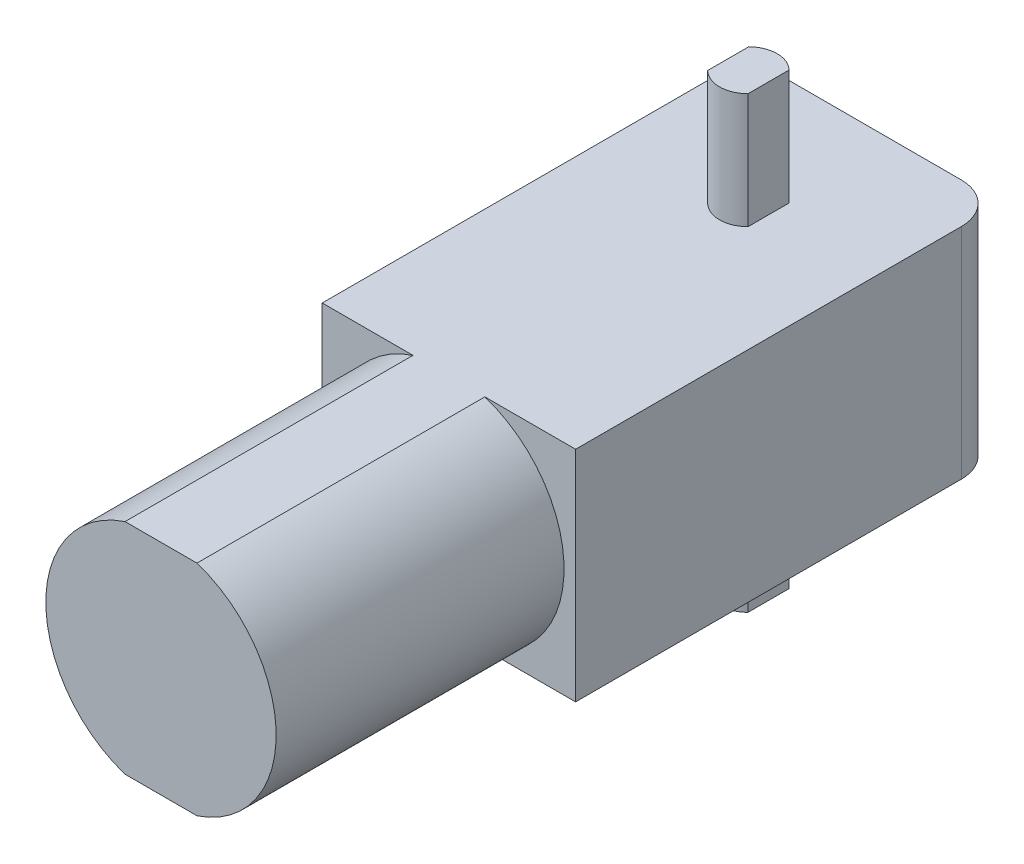
ISO-10303-21;
HEADER;
FILE_DESCRIPTION(('STEP AP214'),'2;1');
FILE_NAME('part.step','',(''),(''),'','','');
FILE_SCHEMA(('AUTOMOTIVE_DESIGN { 1 0 10303 214 1 1 1 1 }'));
ENDSEC;
DATA;
#1=APPLICATION_CONTEXT('core data for automotive mechanical design processes');
#2=APPLICATION_PROTOCOL_DEFINITION('international standard','automotive_design',2000,#1);
#3=PRODUCT_CONTEXT('',#1,'mechanical');
#4=PRODUCT('Part','Part','',(#3));
#5=PRODUCT_RELATED_PRODUCT_CATEGORY('part','',(#4));
#6=PRODUCT_DEFINITION_FORMATION('','',#4);
#7=PRODUCT_DEFINITION_CONTEXT('part definition',#1,'design');
#8=PRODUCT_DEFINITION('design','',#6,#7);
#9=PRODUCT_DEFINITION_SHAPE('','',#8);
#10=(LENGTH_UNIT() NAMED_UNIT(*) SI_UNIT(.MILLI.,.METRE.));
#11=(NAMED_UNIT(*) PLANE_ANGLE_UNIT() SI_UNIT($,.RADIAN.));
#12=(NAMED_UNIT(*) SI_UNIT($,.STERADIAN.) SOLID_ANGLE_UNIT());
#13=UNCERTAINTY_MEASURE_WITH_UNIT(LENGTH_MEASURE(1.E-05),#10,'distance_accuracy_value','');
#14=(GEOMETRIC_REPRESENTATION_CONTEXT(3) GLOBAL_UNCERTAINTY_ASSIGNED_CONTEXT((#13)) GLOBAL_UNIT_ASSIGNED_CONTEXT((#10,
#11,#12)) REPRESENTATION_CONTEXT('',''));
#15=CARTESIAN_POINT('',(0.,0.,0.));
#16=DIRECTION('',(0.,0.,1.));
#17=DIRECTION('',(1.,0.,0.));
#18=AXIS2_PLACEMENT_3D('',#15,#16,#17);
#19=CARTESIAN_POINT('',(0.,0.,37.));
#20=DIRECTION('',(0.,0.,-1.));
#21=DIRECTION('',(-1.,0.,0.));
#22=AXIS2_PLACEMENT_3D('',#19,#20,#21);
#23=PLANE('',#22);
#24=CARTESIAN_POINT('',(-11.,9.5,37.));
#25=DIRECTION('',(0.,0.,1.));
#26=DIRECTION('',(1.,0.,0.));
#27=AXIS2_PLACEMENT_3D('',#24,#25,#26);
#28=CIRCLE('',#27,10.);
#29=CARTESIAN_POINT('',(-7.8775010008008,0.,37.));
#30=VERTEX_POINT('',#29);
#31=CARTESIAN_POINT('',(-7.8775010008008,19.,37.));
#32=VERTEX_POINT('',#31);
#33=EDGE_CURVE('E185',#30,#32,#28,.T.);
#34=ORIENTED_EDGE('',*,*,#33,.F.);
#35=DIRECTION('',(1.,0.,0.));
#36=VECTOR('',#35,1.);
#37=CARTESIAN_POINT('',(0.,0.,37.));
#38=LINE('',#37,#36);
#39=CARTESIAN_POINT('',(0.,0.,37.));
#40=VERTEX_POINT('',#39);
#41=EDGE_CURVE('E246',#30,#40,#38,.T.);
#42=ORIENTED_EDGE('',*,*,#41,.T.);
#43=DIRECTION('',(0.,1.,0.));
#44=VECTOR('',#43,1.);
#45=CARTESIAN_POINT('',(0.,0.,37.));
#46=LINE('',#45,#44);
#47=CARTESIAN_POINT('',(0.,19.,37.));
#48=VERTEX_POINT('',#47);
#49=EDGE_CURVE('E245',#40,#48,#46,.T.);
#50=ORIENTED_EDGE('',*,*,#49,.T.);
#51=DIRECTION('',(-1.,0.,0.));
#52=VECTOR('',#51,1.);
#53=CARTESIAN_POINT('',(0.,19.,37.));
#54=LINE('',#53,#52);
#55=EDGE_CURVE('E64',#48,#32,#54,.T.);
#56=ORIENTED_EDGE('',*,*,#55,.T.);
#57=EDGE_LOOP('',(#34,#42,#50,#56));
#58=FACE_BOUND('',#57,.T.);
#59=ADVANCED_FACE('F41',(#58),#23,.F.);
#60=CARTESIAN_POINT('',(0.,0.,37.));
#61=DIRECTION('',(0.,1.,0.));
#62=DIRECTION('',(0.,0.,1.));
#63=AXIS2_PLACEMENT_3D('',#60,#61,#62);
#64=PLANE('',#63);
#65=DIRECTION('',(0.,0.,1.));
#66=VECTOR('',#65,1.);
#67=CARTESIAN_POINT('',(-9.24999999999997,0.,37.));
#68=LINE('',#67,#66);
#69=CARTESIAN_POINT('',(-9.25,0.,9.21464289286429));
#70=VERTEX_POINT('',#69);
#71=CARTESIAN_POINT('',(-9.24999999999999,0.,12.7853571071357));
#72=VERTEX_POINT('',#71);
#73=EDGE_CURVE('E239',#70,#72,#68,.T.);
#74=ORIENTED_EDGE('',*,*,#73,.F.);
#75=CARTESIAN_POINT('',(-11.,0.,11.));
#76=DIRECTION('',(0.,1.,0.));
#77=DIRECTION('',(0.,0.,1.));
#78=AXIS2_PLACEMENT_3D('',#75,#76,#77);
#79=CIRCLE('',#78,2.5);
#80=CARTESIAN_POINT('',(-12.75,0.,9.21464289286429));
#81=VERTEX_POINT('',#80);
#82=EDGE_CURVE('E236',#81,#70,#79,.F.);
#83=ORIENTED_EDGE('',*,*,#82,.F.);
#84=DIRECTION('',(0.,0.,1.));
#85=VECTOR('',#84,1.);
#86=CARTESIAN_POINT('',(-12.75,0.,37.));
#87=LINE('',#86,#85);
#88=CARTESIAN_POINT('',(-12.75,0.,12.7853571071357));
#89=VERTEX_POINT('',#88);
#90=EDGE_CURVE('E234',#81,#89,#87,.T.);
#91=ORIENTED_EDGE('',*,*,#90,.T.);
#92=CARTESIAN_POINT('',(-11.,0.,11.));
#93=DIRECTION('',(0.,1.,0.));
#94=DIRECTION('',(0.,0.,1.));
#95=AXIS2_PLACEMENT_3D('',#92,#93,#94);
#96=CIRCLE('',#95,2.5);
#97=EDGE_CURVE('E231',#72,#89,#96,.F.);
#98=ORIENTED_EDGE('',*,*,#97,.F.);
#99=EDGE_LOOP('',(#74,#83,#91,#98));
#100=FACE_BOUND('',#99,.T.);
#101=DIRECTION('',(0.,0.,-1.));
#102=VECTOR('',#101,1.);
#103=CARTESIAN_POINT('',(-22.,0.,37.));
#104=LINE('',#103,#102);
#105=CARTESIAN_POINT('',(-22.,0.,37.));
#106=VERTEX_POINT('',#105);
#107=CARTESIAN_POINT('',(-22.,0.,3.5));
#108=VERTEX_POINT('',#107);
#109=EDGE_CURVE('E251',#106,#108,#104,.T.);
#110=ORIENTED_EDGE('',*,*,#109,.T.);
#111=CARTESIAN_POINT('',(-18.5,0.,3.5));
#112=DIRECTION('',(0.,1.,0.));
#113=DIRECTION('',(0.,0.,1.));
#114=AXIS2_PLACEMENT_3D('',#111,#112,#113);
#115=CIRCLE('',#114,3.5);
#116=CARTESIAN_POINT('',(-18.5,0.,0.));
#117=VERTEX_POINT('',#116);
#118=EDGE_CURVE('E272',#108,#117,#115,.F.);
#119=ORIENTED_EDGE('',*,*,#118,.T.);
#120=DIRECTION('',(1.,0.,0.));
#121=VECTOR('',#120,1.);
#122=CARTESIAN_POINT('',(0.,0.,0.));
#123=LINE('',#122,#121);
#124=CARTESIAN_POINT('',(-3.5,0.,0.));
#125=VERTEX_POINT('',#124);
#126=EDGE_CURVE('E242',#117,#125,#123,.T.);
#127=ORIENTED_EDGE('',*,*,#126,.T.);
#128=CARTESIAN_POINT('',(-3.5,0.,3.5));
#129=DIRECTION('',(0.,1.,0.));
#130=DIRECTION('',(0.,0.,1.));
#131=AXIS2_PLACEMENT_3D('',#128,#129,#130);
#132=CIRCLE('',#131,3.5);
#133=CARTESIAN_POINT('',(0.,0.,3.5));
#134=VERTEX_POINT('',#133);
#135=EDGE_CURVE('E270',#125,#134,#132,.F.);
#136=ORIENTED_EDGE('',*,*,#135,.T.);
#137=DIRECTION('',(0.,0.,-1.));
#138=VECTOR('',#137,1.);
#139=CARTESIAN_POINT('',(0.,0.,37.));
#140=LINE('',#139,#138);
#141=EDGE_CURVE('E264',#40,#134,#140,.T.);
#142=ORIENTED_EDGE('',*,*,#141,.F.);
#143=ORIENTED_EDGE('',*,*,#41,.F.);
#144=DIRECTION('',(0.,0.,-1.));
#145=VECTOR('',#144,1.);
#146=CARTESIAN_POINT('',(-7.8775010008008,0.,62.));
#147=LINE('',#146,#145);
#148=CARTESIAN_POINT('',(-7.8775010008008,0.,62.));
#149=VERTEX_POINT('',#148);
#150=EDGE_CURVE('E196',#149,#30,#147,.T.);
#151=ORIENTED_EDGE('',*,*,#150,.F.);
#152=DIRECTION('',(1.,0.,0.));
#153=VECTOR('',#152,1.);
#154=CARTESIAN_POINT('',(0.,0.,62.));
#155=LINE('',#154,#153);
#156=CARTESIAN_POINT('',(-14.1224989991992,0.,62.));
#157=VERTEX_POINT('',#156);
#158=EDGE_CURVE('E175',#157,#149,#155,.T.);
#159=ORIENTED_EDGE('',*,*,#158,.F.);
#160=DIRECTION('',(0.,0.,-1.));
#161=VECTOR('',#160,1.);
#162=CARTESIAN_POINT('',(-14.1224989991992,0.,62.));
#163=LINE('',#162,#161);
#164=CARTESIAN_POINT('',(-14.1224989991992,0.,37.));
#165=VERTEX_POINT('',#164);
#166=EDGE_CURVE('E172',#157,#165,#163,.T.);
#167=ORIENTED_EDGE('',*,*,#166,.T.);
#168=EDGE_CURVE('E243',#106,#165,#38,.T.);
#169=ORIENTED_EDGE('',*,*,#168,.F.);
#170=EDGE_LOOP('',(#110,#119,#127,#136,#142,#143,#151,#159,#167,#169));
#171=FACE_BOUND('',#170,.T.);
#172=ADVANCED_FACE('F327',(#100,#171),#64,.F.);
#173=CARTESIAN_POINT('',(0.,0.,37.));
#174=DIRECTION('',(-1.,0.,0.));
#175=DIRECTION('',(0.,0.,1.));
#176=AXIS2_PLACEMENT_3D('',#173,#174,#175);
#177=PLANE('',#176);
#178=ORIENTED_EDGE('',*,*,#141,.T.);
#179=DIRECTION('',(0.,1.,0.));
#180=VECTOR('',#179,1.);
#181=CARTESIAN_POINT('',(0.,19.,3.5));
#182=LINE('',#181,#180);
#183=CARTESIAN_POINT('',(0.,19.,3.5));
#184=VERTEX_POINT('',#183);
#185=EDGE_CURVE('E282',#134,#184,#182,.T.);
#186=ORIENTED_EDGE('',*,*,#185,.T.);
#187=DIRECTION('',(0.,0.,-1.));
#188=VECTOR('',#187,1.);
#189=CARTESIAN_POINT('',(0.,19.,37.));
#190=LINE('',#189,#188);
#191=EDGE_CURVE('E261',#48,#184,#190,.T.);
#192=ORIENTED_EDGE('',*,*,#191,.F.);
#193=ORIENTED_EDGE('',*,*,#49,.F.);
#194=EDGE_LOOP('',(#178,#186,#192,#193));
#195=FACE_BOUND('',#194,.T.);
#196=ADVANCED_FACE('F347',(#195),#177,.F.);
#197=CARTESIAN_POINT('',(0.,19.,37.));
#198=DIRECTION('',(0.,-1.,0.));
#199=DIRECTION('',(0.,0.,-1.));
#200=AXIS2_PLACEMENT_3D('',#197,#198,#199);
#201=PLANE('',#200);
#202=DIRECTION('',(0.,0.,-1.));
#203=VECTOR('',#202,1.);
#204=CARTESIAN_POINT('',(-9.24999999999997,19.,37.));
#205=LINE('',#204,#203);
#206=CARTESIAN_POINT('',(-9.24999999999999,19.,12.7853571071357));
#207=VERTEX_POINT('',#206);
#208=CARTESIAN_POINT('',(-9.25,19.,9.21464289286429));
#209=VERTEX_POINT('',#208);
#210=EDGE_CURVE('E11',#207,#209,#205,.T.);
#211=ORIENTED_EDGE('',*,*,#210,.F.);
#212=CARTESIAN_POINT('',(-11.,19.,11.));
#213=DIRECTION('',(0.,-1.,0.));
#214=DIRECTION('',(0.,0.,-1.));
#215=AXIS2_PLACEMENT_3D('',#212,#213,#214);
#216=CIRCLE('',#215,2.5);
#217=CARTESIAN_POINT('',(-12.75,19.,12.7853571071357));
#218=VERTEX_POINT('',#217);
#219=EDGE_CURVE('E285',#218,#207,#216,.F.);
#220=ORIENTED_EDGE('',*,*,#219,.F.);
#221=DIRECTION('',(0.,0.,-1.));
#222=VECTOR('',#221,1.);
#223=CARTESIAN_POINT('',(-12.75,19.,37.));
#224=LINE('',#223,#222);
#225=CARTESIAN_POINT('',(-12.75,19.,9.21464289286429));
#226=VERTEX_POINT('',#225);
#227=EDGE_CURVE('E288',#218,#226,#224,.T.);
#228=ORIENTED_EDGE('',*,*,#227,.T.);
#229=CARTESIAN_POINT('',(-11.,19.,11.));
#230=DIRECTION('',(0.,-1.,0.));
#231=DIRECTION('',(0.,0.,-1.));
#232=AXIS2_PLACEMENT_3D('',#229,#230,#231);
#233=CIRCLE('',#232,2.5);
#234=EDGE_CURVE('E49',#209,#226,#233,.F.);
#235=ORIENTED_EDGE('',*,*,#234,.F.);
#236=EDGE_LOOP('',(#211,#220,#228,#235));
#237=FACE_BOUND('',#236,.T.);
#238=DIRECTION('',(-1.,0.,0.));
#239=VECTOR('',#238,1.);
#240=CARTESIAN_POINT('',(0.,19.,0.));
#241=LINE('',#240,#239);
#242=CARTESIAN_POINT('',(-3.5,19.,0.));
#243=VERTEX_POINT('',#242);
#244=CARTESIAN_POINT('',(-18.5,19.,0.));
#245=VERTEX_POINT('',#244);
#246=EDGE_CURVE('E254',#243,#245,#241,.T.);
#247=ORIENTED_EDGE('',*,*,#246,.T.);
#248=CARTESIAN_POINT('',(-18.5,19.,3.5));
#249=DIRECTION('',(0.,-1.,0.));
#250=DIRECTION('',(0.,0.,-1.));
#251=AXIS2_PLACEMENT_3D('',#248,#249,#250);
#252=CIRCLE('',#251,3.5);
#253=CARTESIAN_POINT('',(-22.,19.,3.5));
#254=VERTEX_POINT('',#253);
#255=EDGE_CURVE('E280',#245,#254,#252,.F.);
#256=ORIENTED_EDGE('',*,*,#255,.T.);
#257=DIRECTION('',(0.,0.,-1.));
#258=VECTOR('',#257,1.);
#259=CARTESIAN_POINT('',(-22.,19.,37.));
#260=LINE('',#259,#258);
#261=CARTESIAN_POINT('',(-22.,19.,37.));
#262=VERTEX_POINT('',#261);
#263=EDGE_CURVE('E258',#262,#254,#260,.T.);
#264=ORIENTED_EDGE('',*,*,#263,.F.);
#265=CARTESIAN_POINT('',(-14.1224989991992,19.,37.));
#266=VERTEX_POINT('',#265);
#267=EDGE_CURVE('E190',#266,#262,#54,.T.);
#268=ORIENTED_EDGE('',*,*,#267,.F.);
#269=DIRECTION('',(0.,0.,-1.));
#270=VECTOR('',#269,1.);
#271=CARTESIAN_POINT('',(-14.1224989991992,19.,62.));
#272=LINE('',#271,#270);
#273=CARTESIAN_POINT('',(-14.1224989991992,19.,62.));
#274=VERTEX_POINT('',#273);
#275=EDGE_CURVE('E170',#274,#266,#272,.T.);
#276=ORIENTED_EDGE('',*,*,#275,.F.);
#277=DIRECTION('',(-1.,0.,0.));
#278=VECTOR('',#277,1.);
#279=CARTESIAN_POINT('',(0.,19.,62.));
#280=LINE('',#279,#278);
#281=CARTESIAN_POINT('',(-7.8775010008008,19.,62.));
#282=VERTEX_POINT('',#281);
#283=EDGE_CURVE('E176',#282,#274,#280,.T.);
#284=ORIENTED_EDGE('',*,*,#283,.F.);
#285=DIRECTION('',(0.,0.,-1.));
#286=VECTOR('',#285,1.);
#287=CARTESIAN_POINT('',(-7.8775010008008,19.,62.));
#288=LINE('',#287,#286);
#289=EDGE_CURVE('E387',#282,#32,#288,.T.);
#290=ORIENTED_EDGE('',*,*,#289,.T.);
#291=ORIENTED_EDGE('',*,*,#55,.F.);
#292=ORIENTED_EDGE('',*,*,#191,.T.);
#293=CARTESIAN_POINT('',(-3.5,19.,3.5));
#294=DIRECTION('',(0.,-1.,0.));
#295=DIRECTION('',(0.,0.,-1.));
#296=AXIS2_PLACEMENT_3D('',#293,#294,#295);
#297=CIRCLE('',#296,3.5);
#298=EDGE_CURVE('E278',#184,#243,#297,.F.);
#299=ORIENTED_EDGE('',*,*,#298,.T.);
#300=EDGE_LOOP('',(#247,#256,#264,#268,#276,#284,#290,#291,#292,#299));
#301=FACE_BOUND('',#300,.T.);
#302=ADVANCED_FACE('F188',(#237,#301),#201,.F.);
#303=CARTESIAN_POINT('',(-22.,0.,37.));
#304=DIRECTION('',(1.,0.,0.));
#305=DIRECTION('',(0.,0.,-1.));
#306=AXIS2_PLACEMENT_3D('',#303,#304,#305);
#307=PLANE('',#306);
#308=ORIENTED_EDGE('',*,*,#263,.T.);
#309=DIRECTION('',(0.,-1.,0.));
#310=VECTOR('',#309,1.);
#311=CARTESIAN_POINT('',(-22.,0.,3.5));
#312=LINE('',#311,#310);
#313=EDGE_CURVE('E267',#254,#108,#312,.T.);
#314=ORIENTED_EDGE('',*,*,#313,.T.);
#315=ORIENTED_EDGE('',*,*,#109,.F.);
#316=DIRECTION('',(0.,-1.,0.));
#317=VECTOR('',#316,1.);
#318=CARTESIAN_POINT('',(-22.,0.,37.));
#319=LINE('',#318,#317);
#320=EDGE_CURVE('E249',#262,#106,#319,.T.);
#321=ORIENTED_EDGE('',*,*,#320,.F.);
#322=EDGE_LOOP('',(#308,#314,#315,#321));
#323=FACE_BOUND('',#322,.T.);
#324=ADVANCED_FACE('F352',(#323),#307,.F.);
#325=CARTESIAN_POINT('',(-11.,9.5,37.));
#326=DIRECTION('',(0.,0.,1.));
#327=DIRECTION('',(1.,0.,0.));
#328=AXIS2_PLACEMENT_3D('',#325,#326,#327);
#329=CIRCLE('',#328,10.);
#330=EDGE_CURVE('E56',#266,#165,#329,.T.);
#331=ORIENTED_EDGE('',*,*,#330,.F.);
#332=ORIENTED_EDGE('',*,*,#267,.T.);
#333=ORIENTED_EDGE('',*,*,#320,.T.);
#334=ORIENTED_EDGE('',*,*,#168,.T.);
#335=EDGE_LOOP('',(#331,#332,#333,#334));
#336=FACE_BOUND('',#335,.T.);
#337=ADVANCED_FACE('F342',(#336),#23,.F.);
#338=CARTESIAN_POINT('',(0.,0.,0.));
#339=DIRECTION('',(0.,0.,-1.));
#340=DIRECTION('',(-1.,0.,0.));
#341=AXIS2_PLACEMENT_3D('',#338,#339,#340);
#342=PLANE('',#341);
#343=ORIENTED_EDGE('',*,*,#126,.F.);
#344=DIRECTION('',(0.,-1.,0.));
#345=VECTOR('',#344,1.);
#346=CARTESIAN_POINT('',(-18.5,19.,0.));
#347=LINE('',#346,#345);
#348=EDGE_CURVE('E276',#117,#245,#347,.F.);
#349=ORIENTED_EDGE('',*,*,#348,.T.);
#350=ORIENTED_EDGE('',*,*,#246,.F.);
#351=DIRECTION('',(0.,1.,0.));
#352=VECTOR('',#351,1.);
#353=CARTESIAN_POINT('',(-3.5,0.,0.));
#354=LINE('',#353,#352);
#355=EDGE_CURVE('E274',#243,#125,#354,.F.);
#356=ORIENTED_EDGE('',*,*,#355,.T.);
#357=EDGE_LOOP('',(#343,#349,#350,#356));
#358=FACE_BOUND('',#357,.T.);
#359=ADVANCED_FACE('F351',(#358),#342,.T.);
#360=CARTESIAN_POINT('',(-18.5,0.,3.5));
#361=DIRECTION('',(0.,1.,0.));
#362=DIRECTION('',(0.,0.,1.));
#363=AXIS2_PLACEMENT_3D('',#360,#361,#362);
#364=CYLINDRICAL_SURFACE('',#363,3.5);
#365=ORIENTED_EDGE('',*,*,#255,.F.);
#366=ORIENTED_EDGE('',*,*,#348,.F.);
#367=ORIENTED_EDGE('',*,*,#118,.F.);
#368=ORIENTED_EDGE('',*,*,#313,.F.);
#369=EDGE_LOOP('',(#365,#366,#367,#368));
#370=FACE_BOUND('',#369,.T.);
#371=ADVANCED_FACE('F358',(#370),#364,.T.);
#372=CARTESIAN_POINT('',(-3.5,0.,3.5));
#373=DIRECTION('',(0.,-1.,0.));
#374=DIRECTION('',(0.,0.,-1.));
#375=AXIS2_PLACEMENT_3D('',#372,#373,#374);
#376=CYLINDRICAL_SURFACE('',#375,3.5);
#377=ORIENTED_EDGE('',*,*,#135,.F.);
#378=ORIENTED_EDGE('',*,*,#355,.F.);
#379=ORIENTED_EDGE('',*,*,#298,.F.);
#380=ORIENTED_EDGE('',*,*,#185,.F.);
#381=EDGE_LOOP('',(#377,#378,#379,#380));
#382=FACE_BOUND('',#381,.T.);
#383=ADVANCED_FACE('F43',(#382),#376,.T.);
#384=CARTESIAN_POINT('',(0.,29.,0.));
#385=DIRECTION('',(0.,1.,0.));
#386=DIRECTION('',(0.,0.,1.));
#387=AXIS2_PLACEMENT_3D('',#384,#385,#386);
#388=PLANE('',#387);
#389=DIRECTION('',(0.,0.,-1.));
#390=VECTOR('',#389,1.);
#391=CARTESIAN_POINT('',(-9.25000000000001,29.,0.));
#392=LINE('',#391,#390);
#393=CARTESIAN_POINT('',(-9.24999999999999,29.,12.7853571071357));
#394=VERTEX_POINT('',#393);
#395=CARTESIAN_POINT('',(-9.25,29.,9.21464289286429));
#396=VERTEX_POINT('',#395);
#397=EDGE_CURVE('E200',#394,#396,#392,.T.);
#398=ORIENTED_EDGE('',*,*,#397,.T.);
#399=CARTESIAN_POINT('',(-11.,29.,11.));
#400=DIRECTION('',(0.,1.,0.));
#401=DIRECTION('',(0.,0.,1.));
#402=AXIS2_PLACEMENT_3D('',#399,#400,#401);
#403=CIRCLE('',#402,2.5);
#404=CARTESIAN_POINT('',(-12.75,29.,9.21464289286429));
#405=VERTEX_POINT('',#404);
#406=EDGE_CURVE('E203',#396,#405,#403,.T.);
#407=ORIENTED_EDGE('',*,*,#406,.T.);
#408=DIRECTION('',(0.,0.,-1.));
#409=VECTOR('',#408,1.);
#410=CARTESIAN_POINT('',(-12.75,29.,0.));
#411=LINE('',#410,#409);
#412=CARTESIAN_POINT('',(-12.75,29.,12.7853571071357));
#413=VERTEX_POINT('',#412);
#414=EDGE_CURVE('E206',#413,#405,#411,.T.);
#415=ORIENTED_EDGE('',*,*,#414,.F.);
#416=EDGE_CURVE('E207',#413,#394,#403,.T.);
#417=ORIENTED_EDGE('',*,*,#416,.T.);
#418=EDGE_LOOP('',(#398,#407,#415,#417));
#419=FACE_BOUND('',#418,.T.);
#420=ADVANCED_FACE('F301',(#419),#388,.T.);
#421=CARTESIAN_POINT('',(-11.,29.,11.));
#422=DIRECTION('',(0.,-1.,0.));
#423=DIRECTION('',(0.,0.,-1.));
#424=AXIS2_PLACEMENT_3D('',#421,#422,#423);
#425=CYLINDRICAL_SURFACE('',#424,2.5);
#426=DIRECTION('',(0.,-1.,0.));
#427=VECTOR('',#426,1.);
#428=CARTESIAN_POINT('',(-12.75,29.,12.7853571071357));
#429=LINE('',#428,#427);
#430=EDGE_CURVE('E220',#413,#218,#429,.T.);
#431=ORIENTED_EDGE('',*,*,#430,.T.);
#432=ORIENTED_EDGE('',*,*,#219,.T.);
#433=DIRECTION('',(0.,-1.,0.));
#434=VECTOR('',#433,1.);
#435=CARTESIAN_POINT('',(-9.24999999999999,29.,12.7853571071357));
#436=LINE('',#435,#434);
#437=EDGE_CURVE('E215',#394,#207,#436,.T.);
#438=ORIENTED_EDGE('',*,*,#437,.F.);
#439=ORIENTED_EDGE('',*,*,#416,.F.);
#440=EDGE_LOOP('',(#431,#432,#438,#439));
#441=FACE_BOUND('',#440,.T.);
#442=ADVANCED_FACE('F307',(#441),#425,.T.);
#443=CARTESIAN_POINT('',(-12.75,29.,0.));
#444=DIRECTION('',(-1.,0.,0.));
#445=DIRECTION('',(0.,0.,1.));
#446=AXIS2_PLACEMENT_3D('',#443,#444,#445);
#447=PLANE('',#446);
#448=ORIENTED_EDGE('',*,*,#227,.F.);
#449=ORIENTED_EDGE('',*,*,#430,.F.);
#450=ORIENTED_EDGE('',*,*,#414,.T.);
#451=DIRECTION('',(0.,-1.,0.));
#452=VECTOR('',#451,1.);
#453=CARTESIAN_POINT('',(-12.75,29.,9.21464289286429));
#454=LINE('',#453,#452);
#455=EDGE_CURVE('E224',#405,#226,#454,.T.);
#456=ORIENTED_EDGE('',*,*,#455,.T.);
#457=EDGE_LOOP('',(#448,#449,#450,#456));
#458=FACE_BOUND('',#457,.T.);
#459=ADVANCED_FACE('F297',(#458),#447,.T.);
#460=DIRECTION('',(0.,-1.,0.));
#461=VECTOR('',#460,1.);
#462=CARTESIAN_POINT('',(-9.25,29.,9.21464289286429));
#463=LINE('',#462,#461);
#464=EDGE_CURVE('E228',#396,#209,#463,.T.);
#465=ORIENTED_EDGE('',*,*,#464,.T.);
#466=ORIENTED_EDGE('',*,*,#234,.T.);
#467=ORIENTED_EDGE('',*,*,#455,.F.);
#468=ORIENTED_EDGE('',*,*,#406,.F.);
#469=EDGE_LOOP('',(#465,#466,#467,#468));
#470=FACE_BOUND('',#469,.T.);
#471=ADVANCED_FACE('F292',(#470),#425,.T.);
#472=CARTESIAN_POINT('',(-9.25000000000001,29.,0.));
#473=DIRECTION('',(-1.,0.,0.));
#474=DIRECTION('',(0.,0.,1.));
#475=AXIS2_PLACEMENT_3D('',#472,#473,#474);
#476=PLANE('',#475);
#477=ORIENTED_EDGE('',*,*,#437,.T.);
#478=ORIENTED_EDGE('',*,*,#210,.T.);
#479=ORIENTED_EDGE('',*,*,#464,.F.);
#480=ORIENTED_EDGE('',*,*,#397,.F.);
#481=EDGE_LOOP('',(#477,#478,#479,#480));
#482=FACE_BOUND('',#481,.T.);
#483=ADVANCED_FACE('F305',(#482),#476,.F.);
#484=CARTESIAN_POINT('',(-9.25,-10.,9.21464289286429));
#485=VERTEX_POINT('',#484);
#486=EDGE_CURVE('E227',#70,#485,#463,.T.);
#487=ORIENTED_EDGE('',*,*,#486,.F.);
#488=ORIENTED_EDGE('',*,*,#73,.T.);
#489=CARTESIAN_POINT('',(-9.24999999999999,-10.,12.7853571071357));
#490=VERTEX_POINT('',#489);
#491=EDGE_CURVE('E219',#72,#490,#436,.T.);
#492=ORIENTED_EDGE('',*,*,#491,.T.);
#493=DIRECTION('',(0.,0.,-1.));
#494=VECTOR('',#493,1.);
#495=CARTESIAN_POINT('',(-9.25000000000001,-10.,0.));
#496=LINE('',#495,#494);
#497=EDGE_CURVE('E191',#490,#485,#496,.T.);
#498=ORIENTED_EDGE('',*,*,#497,.T.);
#499=EDGE_LOOP('',(#487,#488,#492,#498));
#500=FACE_BOUND('',#499,.T.);
#501=ADVANCED_FACE('F312',(#500),#476,.F.);
#502=CARTESIAN_POINT('',(-12.75,-10.,9.21464289286429));
#503=VERTEX_POINT('',#502);
#504=EDGE_CURVE('E223',#81,#503,#454,.T.);
#505=ORIENTED_EDGE('',*,*,#504,.F.);
#506=ORIENTED_EDGE('',*,*,#82,.T.);
#507=ORIENTED_EDGE('',*,*,#486,.T.);
#508=CARTESIAN_POINT('',(-11.,-10.,11.));
#509=DIRECTION('',(0.,1.,0.));
#510=DIRECTION('',(0.,0.,1.));
#511=AXIS2_PLACEMENT_3D('',#508,#509,#510);
#512=CIRCLE('',#511,2.5);
#513=EDGE_CURVE('E194',#485,#503,#512,.T.);
#514=ORIENTED_EDGE('',*,*,#513,.T.);
#515=EDGE_LOOP('',(#505,#506,#507,#514));
#516=FACE_BOUND('',#515,.T.);
#517=ADVANCED_FACE('F324',(#516),#425,.T.);
#518=ORIENTED_EDGE('',*,*,#90,.F.);
#519=ORIENTED_EDGE('',*,*,#504,.T.);
#520=DIRECTION('',(0.,0.,-1.));
#521=VECTOR('',#520,1.);
#522=CARTESIAN_POINT('',(-12.75,-10.,0.));
#523=LINE('',#522,#521);
#524=CARTESIAN_POINT('',(-12.75,-10.,12.7853571071357));
#525=VERTEX_POINT('',#524);
#526=EDGE_CURVE('E212',#525,#503,#523,.T.);
#527=ORIENTED_EDGE('',*,*,#526,.F.);
#528=EDGE_CURVE('E218',#89,#525,#429,.T.);
#529=ORIENTED_EDGE('',*,*,#528,.F.);
#530=EDGE_LOOP('',(#518,#519,#527,#529));
#531=FACE_BOUND('',#530,.T.);
#532=ADVANCED_FACE('F330',(#531),#447,.T.);
#533=ORIENTED_EDGE('',*,*,#491,.F.);
#534=ORIENTED_EDGE('',*,*,#97,.T.);
#535=ORIENTED_EDGE('',*,*,#528,.T.);
#536=EDGE_CURVE('E204',#525,#490,#512,.T.);
#537=ORIENTED_EDGE('',*,*,#536,.T.);
#538=EDGE_LOOP('',(#533,#534,#535,#537));
#539=FACE_BOUND('',#538,.T.);
#540=ADVANCED_FACE('F316',(#539),#425,.T.);
#541=CARTESIAN_POINT('',(0.,-10.,0.));
#542=DIRECTION('',(0.,1.,0.));
#543=DIRECTION('',(0.,0.,1.));
#544=AXIS2_PLACEMENT_3D('',#541,#542,#543);
#545=PLANE('',#544);
#546=ORIENTED_EDGE('',*,*,#497,.F.);
#547=ORIENTED_EDGE('',*,*,#536,.F.);
#548=ORIENTED_EDGE('',*,*,#526,.T.);
#549=ORIENTED_EDGE('',*,*,#513,.F.);
#550=EDGE_LOOP('',(#546,#547,#548,#549));
#551=FACE_BOUND('',#550,.T.);
#552=ADVANCED_FACE('F321',(#551),#545,.F.);
#553=CARTESIAN_POINT('',(-11.,9.5,62.));
#554=DIRECTION('',(0.,0.,-1.));
#555=DIRECTION('',(-1.,0.,0.));
#556=AXIS2_PLACEMENT_3D('',#553,#554,#555);
#557=CYLINDRICAL_SURFACE('',#556,10.);
#558=ORIENTED_EDGE('',*,*,#330,.T.);
#559=ORIENTED_EDGE('',*,*,#166,.F.);
#560=CARTESIAN_POINT('',(-11.,9.5,62.));
#561=DIRECTION('',(0.,0.,1.));
#562=DIRECTION('',(1.,0.,0.));
#563=AXIS2_PLACEMENT_3D('',#560,#561,#562);
#564=CIRCLE('',#563,10.);
#565=EDGE_CURVE('E166',#274,#157,#564,.T.);
#566=ORIENTED_EDGE('',*,*,#565,.F.);
#567=ORIENTED_EDGE('',*,*,#275,.T.);
#568=EDGE_LOOP('',(#558,#559,#566,#567));
#569=FACE_BOUND('',#568,.T.);
#570=ADVANCED_FACE('F168',(#569),#557,.T.);
#571=CARTESIAN_POINT('',(-11.,9.5,62.));
#572=DIRECTION('',(0.,0.,-1.));
#573=DIRECTION('',(-1.,0.,0.));
#574=AXIS2_PLACEMENT_3D('',#571,#572,#573);
#575=CYLINDRICAL_SURFACE('',#574,10.);
#576=ORIENTED_EDGE('',*,*,#33,.T.);
#577=ORIENTED_EDGE('',*,*,#289,.F.);
#578=CARTESIAN_POINT('',(-11.,9.5,62.));
#579=DIRECTION('',(0.,0.,1.));
#580=DIRECTION('',(1.,0.,0.));
#581=AXIS2_PLACEMENT_3D('',#578,#579,#580);
#582=CIRCLE('',#581,10.);
#583=EDGE_CURVE('E181',#149,#282,#582,.T.);
#584=ORIENTED_EDGE('',*,*,#583,.F.);
#585=ORIENTED_EDGE('',*,*,#150,.T.);
#586=EDGE_LOOP('',(#576,#577,#584,#585));
#587=FACE_BOUND('',#586,.T.);
#588=ADVANCED_FACE('F392',(#587),#575,.T.);
#589=CARTESIAN_POINT('',(0.,0.,62.));
#590=DIRECTION('',(0.,0.,1.));
#591=DIRECTION('',(1.,0.,0.));
#592=AXIS2_PLACEMENT_3D('',#589,#590,#591);
#593=PLANE('',#592);
#594=ORIENTED_EDGE('',*,*,#283,.T.);
#595=ORIENTED_EDGE('',*,*,#565,.T.);
#596=ORIENTED_EDGE('',*,*,#158,.T.);
#597=ORIENTED_EDGE('',*,*,#583,.T.);
#598=EDGE_LOOP('',(#594,#595,#596,#597));
#599=FACE_BOUND('',#598,.T.);
#600=ADVANCED_FACE('F179',(#599),#593,.T.);
#601=CLOSED_SHELL('',(#59,#172,#196,#302,#324,#337,#359,#371,#383,#420,#442,#459,#471,#483,#501,
#517,#532,#540,#552,#570,#588,#600));
#602=MANIFOLD_SOLID_BREP('B2',#601);
#603=ADVANCED_BREP_SHAPE_REPRESENTATION('',(#18,#602),#14);
#604=SHAPE_DEFINITION_REPRESENTATION(#9,#603);
ENDSEC;
END-ISO-10303-21;
